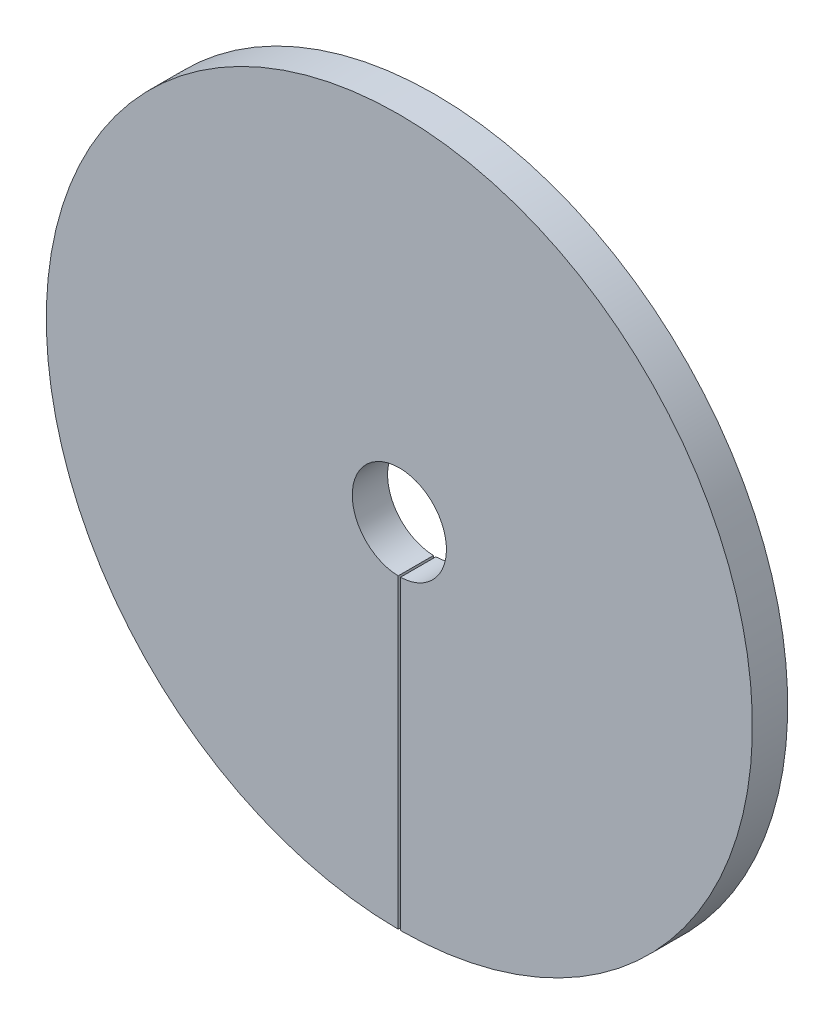
ISO-10303-21;
HEADER;
FILE_DESCRIPTION(('STEP AP214'),'2;1');
FILE_NAME('part.step','',(''),(''),'','','');
FILE_SCHEMA(('AUTOMOTIVE_DESIGN { 1 0 10303 214 1 1 1 1 }'));
ENDSEC;
DATA;
#1=APPLICATION_CONTEXT('core data for automotive mechanical design processes');
#2=APPLICATION_PROTOCOL_DEFINITION('international standard','automotive_design',2000,#1);
#3=PRODUCT_CONTEXT('',#1,'mechanical');
#4=PRODUCT('Part','Part','',(#3));
#5=PRODUCT_RELATED_PRODUCT_CATEGORY('part','',(#4));
#6=PRODUCT_DEFINITION_FORMATION('','',#4);
#7=PRODUCT_DEFINITION_CONTEXT('part definition',#1,'design');
#8=PRODUCT_DEFINITION('design','',#6,#7);
#9=PRODUCT_DEFINITION_SHAPE('','',#8);
#10=(LENGTH_UNIT() NAMED_UNIT(*) SI_UNIT(.MILLI.,.METRE.));
#11=(NAMED_UNIT(*) PLANE_ANGLE_UNIT() SI_UNIT($,.RADIAN.));
#12=(NAMED_UNIT(*) SI_UNIT($,.STERADIAN.) SOLID_ANGLE_UNIT());
#13=UNCERTAINTY_MEASURE_WITH_UNIT(LENGTH_MEASURE(1.E-05),#10,'distance_accuracy_value','');
#14=(GEOMETRIC_REPRESENTATION_CONTEXT(3) GLOBAL_UNCERTAINTY_ASSIGNED_CONTEXT((#13)) GLOBAL_UNIT_ASSIGNED_CONTEXT((#10,
#11,#12)) REPRESENTATION_CONTEXT('',''));
#15=CARTESIAN_POINT('',(0.,0.,0.));
#16=DIRECTION('',(0.,0.,1.));
#17=DIRECTION('',(1.,0.,0.));
#18=AXIS2_PLACEMENT_3D('',#15,#16,#17);
#19=CARTESIAN_POINT('',(0.,0.,3.));
#20=DIRECTION('',(0.,0.,-1.));
#21=DIRECTION('',(-1.,0.,0.));
#22=AXIS2_PLACEMENT_3D('',#19,#20,#21);
#23=CYLINDRICAL_SURFACE('',#22,4.);
#24=CARTESIAN_POINT('',(0.,0.,0.));
#25=DIRECTION('',(0.,0.,-1.));
#26=DIRECTION('',(1.,0.,0.));
#27=AXIS2_PLACEMENT_3D('',#24,#25,#26);
#28=CIRCLE('',#27,4.);
#29=CARTESIAN_POINT('',(-0.100000000000001,-3.99874980462644,0.));
#30=VERTEX_POINT('',#29);
#31=CARTESIAN_POINT('',(0.100000000000001,-3.99874980462644,0.));
#32=VERTEX_POINT('',#31);
#33=EDGE_CURVE('E98',#30,#32,#28,.T.);
#34=ORIENTED_EDGE('',*,*,#33,.T.);
#35=DIRECTION('',(0.,0.,-1.));
#36=VECTOR('',#35,1.);
#37=CARTESIAN_POINT('',(0.100000000000001,-3.99874980462644,3.));
#38=LINE('',#37,#36);
#39=CARTESIAN_POINT('',(0.100000000000001,-3.99874980462644,3.));
#40=VERTEX_POINT('',#39);
#41=EDGE_CURVE('E11',#40,#32,#38,.T.);
#42=ORIENTED_EDGE('',*,*,#41,.F.);
#43=CARTESIAN_POINT('',(0.,0.,3.));
#44=DIRECTION('',(0.,0.,-1.));
#45=DIRECTION('',(1.,0.,0.));
#46=AXIS2_PLACEMENT_3D('',#43,#44,#45);
#47=CIRCLE('',#46,4.);
#48=CARTESIAN_POINT('',(-0.100000000000001,-3.99874980462644,3.));
#49=VERTEX_POINT('',#48);
#50=EDGE_CURVE('E86',#49,#40,#47,.T.);
#51=ORIENTED_EDGE('',*,*,#50,.F.);
#52=DIRECTION('',(0.,0.,-1.));
#53=VECTOR('',#52,1.);
#54=CARTESIAN_POINT('',(-0.100000000000001,-3.99874980462644,3.));
#55=LINE('',#54,#53);
#56=EDGE_CURVE('E94',#49,#30,#55,.T.);
#57=ORIENTED_EDGE('',*,*,#56,.T.);
#58=EDGE_LOOP('',(#34,#42,#51,#57));
#59=FACE_BOUND('',#58,.T.);
#60=ADVANCED_FACE('F35',(#59),#23,.F.);
#61=CARTESIAN_POINT('',(0.100000000000001,-3.99874980462644,3.));
#62=DIRECTION('',(1.,0.,0.));
#63=DIRECTION('',(0.,1.,0.));
#64=AXIS2_PLACEMENT_3D('',#61,#62,#63);
#65=PLANE('',#64);
#66=DIRECTION('',(0.,-1.,0.));
#67=VECTOR('',#66,1.);
#68=CARTESIAN_POINT('',(0.100000000000001,-3.99874980462644,0.));
#69=LINE('',#68,#67);
#70=CARTESIAN_POINT('',(0.100000000000004,-29.9998333328704,0.));
#71=VERTEX_POINT('',#70);
#72=EDGE_CURVE('E90',#32,#71,#69,.T.);
#73=ORIENTED_EDGE('',*,*,#72,.T.);
#74=DIRECTION('',(0.,0.,-1.));
#75=VECTOR('',#74,1.);
#76=CARTESIAN_POINT('',(0.100000000000004,-29.9998333328704,3.));
#77=LINE('',#76,#75);
#78=CARTESIAN_POINT('',(0.100000000000004,-29.9998333328704,3.));
#79=VERTEX_POINT('',#78);
#80=EDGE_CURVE('E43',#79,#71,#77,.T.);
#81=ORIENTED_EDGE('',*,*,#80,.F.);
#82=DIRECTION('',(0.,-1.,0.));
#83=VECTOR('',#82,1.);
#84=CARTESIAN_POINT('',(0.100000000000001,-3.99874980462644,3.));
#85=LINE('',#84,#83);
#86=EDGE_CURVE('E81',#40,#79,#85,.T.);
#87=ORIENTED_EDGE('',*,*,#86,.F.);
#88=ORIENTED_EDGE('',*,*,#41,.T.);
#89=EDGE_LOOP('',(#73,#81,#87,#88));
#90=FACE_BOUND('',#89,.T.);
#91=ADVANCED_FACE('F89',(#90),#65,.F.);
#92=CARTESIAN_POINT('',(0.,0.,3.));
#93=DIRECTION('',(0.,0.,-1.));
#94=DIRECTION('',(-1.,0.,0.));
#95=AXIS2_PLACEMENT_3D('',#92,#93,#94);
#96=CYLINDRICAL_SURFACE('',#95,30.);
#97=CARTESIAN_POINT('',(0.,0.,0.));
#98=DIRECTION('',(0.,0.,1.));
#99=DIRECTION('',(1.,0.,0.));
#100=AXIS2_PLACEMENT_3D('',#97,#98,#99);
#101=CIRCLE('',#100,30.);
#102=CARTESIAN_POINT('',(-0.100000000000016,-29.9998333328704,0.));
#103=VERTEX_POINT('',#102);
#104=EDGE_CURVE('E68',#71,#103,#101,.T.);
#105=ORIENTED_EDGE('',*,*,#104,.T.);
#106=DIRECTION('',(0.,0.,-1.));
#107=VECTOR('',#106,1.);
#108=CARTESIAN_POINT('',(-0.100000000000016,-29.9998333328704,3.));
#109=LINE('',#108,#107);
#110=CARTESIAN_POINT('',(-0.100000000000016,-29.9998333328704,3.));
#111=VERTEX_POINT('',#110);
#112=EDGE_CURVE('E91',#111,#103,#109,.T.);
#113=ORIENTED_EDGE('',*,*,#112,.F.);
#114=CARTESIAN_POINT('',(0.,0.,3.));
#115=DIRECTION('',(0.,0.,1.));
#116=DIRECTION('',(1.,0.,0.));
#117=AXIS2_PLACEMENT_3D('',#114,#115,#116);
#118=CIRCLE('',#117,30.);
#119=EDGE_CURVE('E84',#79,#111,#118,.T.);
#120=ORIENTED_EDGE('',*,*,#119,.F.);
#121=ORIENTED_EDGE('',*,*,#80,.T.);
#122=EDGE_LOOP('',(#105,#113,#120,#121));
#123=FACE_BOUND('',#122,.T.);
#124=ADVANCED_FACE('F92',(#123),#96,.T.);
#125=CARTESIAN_POINT('',(-0.100000000000001,-3.99874980462644,3.));
#126=DIRECTION('',(-1.,0.,0.));
#127=DIRECTION('',(0.,-1.,0.));
#128=AXIS2_PLACEMENT_3D('',#125,#126,#127);
#129=PLANE('',#128);
#130=DIRECTION('',(0.,1.,0.));
#131=VECTOR('',#130,1.);
#132=CARTESIAN_POINT('',(-0.100000000000001,-3.99874980462644,0.));
#133=LINE('',#132,#131);
#134=EDGE_CURVE('E74',#103,#30,#133,.T.);
#135=ORIENTED_EDGE('',*,*,#134,.T.);
#136=ORIENTED_EDGE('',*,*,#56,.F.);
#137=DIRECTION('',(0.,1.,0.));
#138=VECTOR('',#137,1.);
#139=CARTESIAN_POINT('',(-0.100000000000001,-3.99874980462644,3.));
#140=LINE('',#139,#138);
#141=EDGE_CURVE('E51',#111,#49,#140,.T.);
#142=ORIENTED_EDGE('',*,*,#141,.F.);
#143=ORIENTED_EDGE('',*,*,#112,.T.);
#144=EDGE_LOOP('',(#135,#136,#142,#143));
#145=FACE_BOUND('',#144,.T.);
#146=ADVANCED_FACE('F105',(#145),#129,.F.);
#147=CARTESIAN_POINT('',(0.,0.,3.));
#148=DIRECTION('',(0.,0.,1.));
#149=DIRECTION('',(1.,0.,0.));
#150=AXIS2_PLACEMENT_3D('',#147,#148,#149);
#151=PLANE('',#150);
#152=ORIENTED_EDGE('',*,*,#50,.T.);
#153=ORIENTED_EDGE('',*,*,#86,.T.);
#154=ORIENTED_EDGE('',*,*,#119,.T.);
#155=ORIENTED_EDGE('',*,*,#141,.T.);
#156=EDGE_LOOP('',(#152,#153,#154,#155));
#157=FACE_BOUND('',#156,.T.);
#158=ADVANCED_FACE('F82',(#157),#151,.T.);
#159=CARTESIAN_POINT('',(0.,0.,0.));
#160=DIRECTION('',(0.,0.,1.));
#161=DIRECTION('',(1.,0.,0.));
#162=AXIS2_PLACEMENT_3D('',#159,#160,#161);
#163=PLANE('',#162);
#164=ORIENTED_EDGE('',*,*,#33,.F.);
#165=ORIENTED_EDGE('',*,*,#134,.F.);
#166=ORIENTED_EDGE('',*,*,#104,.F.);
#167=ORIENTED_EDGE('',*,*,#72,.F.);
#168=EDGE_LOOP('',(#164,#165,#166,#167));
#169=FACE_BOUND('',#168,.T.);
#170=ADVANCED_FACE('F108',(#169),#163,.F.);
#171=CLOSED_SHELL('',(#60,#91,#124,#146,#158,#170));
#172=MANIFOLD_SOLID_BREP('B2',#171);
#173=ADVANCED_BREP_SHAPE_REPRESENTATION('',(#18,#172),#14);
#174=SHAPE_DEFINITION_REPRESENTATION(#9,#173);
ENDSEC;
END-ISO-10303-21;
